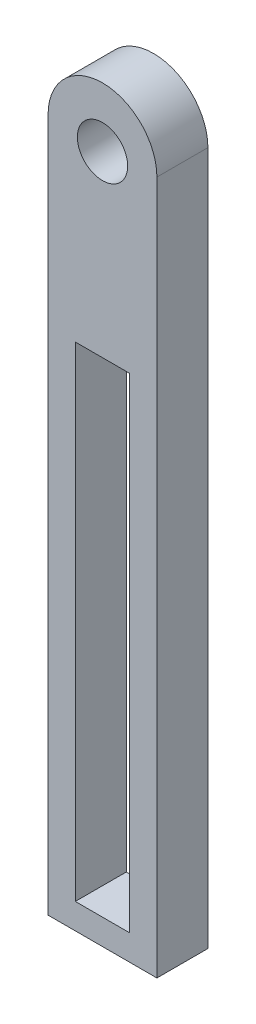
ISO-10303-21;
HEADER;
FILE_DESCRIPTION(('STEP AP214'),'2;1');
FILE_NAME('part.step','',(''),(''),'','','');
FILE_SCHEMA(('AUTOMOTIVE_DESIGN { 1 0 10303 214 1 1 1 1 }'));
ENDSEC;
DATA;
#1=APPLICATION_CONTEXT('core data for automotive mechanical design processes');
#2=APPLICATION_PROTOCOL_DEFINITION('international standard','automotive_design',2000,#1);
#3=PRODUCT_CONTEXT('',#1,'mechanical');
#4=PRODUCT('Part','Part','',(#3));
#5=PRODUCT_RELATED_PRODUCT_CATEGORY('part','',(#4));
#6=PRODUCT_DEFINITION_FORMATION('','',#4);
#7=PRODUCT_DEFINITION_CONTEXT('part definition',#1,'design');
#8=PRODUCT_DEFINITION('design','',#6,#7);
#9=PRODUCT_DEFINITION_SHAPE('','',#8);
#10=(LENGTH_UNIT() NAMED_UNIT(*) SI_UNIT(.MILLI.,.METRE.));
#11=(NAMED_UNIT(*) PLANE_ANGLE_UNIT() SI_UNIT($,.RADIAN.));
#12=(NAMED_UNIT(*) SI_UNIT($,.STERADIAN.) SOLID_ANGLE_UNIT());
#13=UNCERTAINTY_MEASURE_WITH_UNIT(LENGTH_MEASURE(1.E-05),#10,'distance_accuracy_value','');
#14=(GEOMETRIC_REPRESENTATION_CONTEXT(3) GLOBAL_UNCERTAINTY_ASSIGNED_CONTEXT((#13)) GLOBAL_UNIT_ASSIGNED_CONTEXT((#10,
#11,#12)) REPRESENTATION_CONTEXT('',''));
#15=CARTESIAN_POINT('',(0.,0.,0.));
#16=DIRECTION('',(0.,0.,1.));
#17=DIRECTION('',(1.,0.,0.));
#18=AXIS2_PLACEMENT_3D('',#15,#16,#17);
#19=CARTESIAN_POINT('',(-12.0601565913827,-20.4541960659235,9.525));
#20=DIRECTION('',(0.,0.,1.));
#21=DIRECTION('',(1.,0.,0.));
#22=AXIS2_PLACEMENT_3D('',#19,#20,#21);
#23=PLANE('',#22);
#24=DIRECTION('',(-1.,0.,0.));
#25=VECTOR('',#24,1.);
#26=CARTESIAN_POINT('',(-17.1401565913827,-54.7441960659235,9.525));
#27=LINE('',#26,#25);
#28=CARTESIAN_POINT('',(-6.98015659138272,-54.7441960659235,9.525));
#29=VERTEX_POINT('',#28);
#30=CARTESIAN_POINT('',(-17.1401565913827,-54.7441960659235,9.525));
#31=VERTEX_POINT('',#30);
#32=EDGE_CURVE('E114',#29,#31,#27,.T.);
#33=ORIENTED_EDGE('',*,*,#32,.F.);
#34=DIRECTION('',(0.,1.,0.));
#35=VECTOR('',#34,1.);
#36=CARTESIAN_POINT('',(-6.9801565913827,-145.231696065923,9.525));
#37=LINE('',#36,#35);
#38=CARTESIAN_POINT('',(-6.9801565913827,-145.231696065923,9.525));
#39=VERTEX_POINT('',#38);
#40=EDGE_CURVE('E105',#39,#29,#37,.T.);
#41=ORIENTED_EDGE('',*,*,#40,.F.);
#42=DIRECTION('',(1.,0.,0.));
#43=VECTOR('',#42,1.);
#44=CARTESIAN_POINT('',(-17.1401565913827,-145.231696065923,9.525));
#45=LINE('',#44,#43);
#46=CARTESIAN_POINT('',(-17.1401565913827,-145.231696065923,9.525));
#47=VERTEX_POINT('',#46);
#48=EDGE_CURVE('E132',#47,#39,#45,.T.);
#49=ORIENTED_EDGE('',*,*,#48,.F.);
#50=DIRECTION('',(0.,-1.,0.));
#51=VECTOR('',#50,1.);
#52=CARTESIAN_POINT('',(-17.1401565913827,-145.231696065923,9.525));
#53=LINE('',#52,#51);
#54=EDGE_CURVE('E128',#31,#47,#53,.T.);
#55=ORIENTED_EDGE('',*,*,#54,.F.);
#56=EDGE_LOOP('',(#33,#41,#49,#55));
#57=FACE_BOUND('',#56,.T.);
#58=CARTESIAN_POINT('',(-12.0601565913827,-20.4541960659235,9.525));
#59=DIRECTION('',(0.,0.,1.));
#60=DIRECTION('',(1.,0.,0.));
#61=AXIS2_PLACEMENT_3D('',#58,#59,#60);
#62=CIRCLE('',#61,10.16);
#63=CARTESIAN_POINT('',(-1.90015659138274,-20.4541960659234,9.525));
#64=VERTEX_POINT('',#63);
#65=CARTESIAN_POINT('',(-22.2201565913827,-20.4541960659235,9.525));
#66=VERTEX_POINT('',#65);
#67=EDGE_CURVE('E156',#64,#66,#62,.T.);
#68=ORIENTED_EDGE('',*,*,#67,.T.);
#69=DIRECTION('',(0.,-1.,0.));
#70=VECTOR('',#69,1.);
#71=CARTESIAN_POINT('',(-22.2201565913827,-20.4541960659235,9.525));
#72=LINE('',#71,#70);
#73=CARTESIAN_POINT('',(-22.2201565913827,-149.994196065923,9.525));
#74=VERTEX_POINT('',#73);
#75=EDGE_CURVE('E160',#66,#74,#72,.T.);
#76=ORIENTED_EDGE('',*,*,#75,.T.);
#77=DIRECTION('',(1.,0.,0.));
#78=VECTOR('',#77,1.);
#79=CARTESIAN_POINT('',(-22.2201565913827,-149.994196065923,9.525));
#80=LINE('',#79,#78);
#81=CARTESIAN_POINT('',(-1.90015659138269,-149.994196065923,9.525));
#82=VERTEX_POINT('',#81);
#83=EDGE_CURVE('E164',#74,#82,#80,.T.);
#84=ORIENTED_EDGE('',*,*,#83,.T.);
#85=DIRECTION('',(0.,1.,0.));
#86=VECTOR('',#85,1.);
#87=CARTESIAN_POINT('',(-1.90015659138274,-20.4541960659234,9.525));
#88=LINE('',#87,#86);
#89=EDGE_CURVE('E167',#82,#64,#88,.T.);
#90=ORIENTED_EDGE('',*,*,#89,.T.);
#91=EDGE_LOOP('',(#68,#76,#84,#90));
#92=FACE_BOUND('',#91,.T.);
#93=CARTESIAN_POINT('',(-12.0601565913827,-21.4066960659235,9.525));
#94=DIRECTION('',(0.,0.,1.));
#95=DIRECTION('',(1.,0.,0.));
#96=AXIS2_PLACEMENT_3D('',#93,#94,#95);
#97=CIRCLE('',#96,4.699);
#98=CARTESIAN_POINT('',(-16.7591565913827,-21.4066960659235,9.525));
#99=VERTEX_POINT('',#98);
#100=EDGE_CURVE('E140',#99,#99,#97,.T.);
#101=ORIENTED_EDGE('',*,*,#100,.F.);
#102=EDGE_LOOP('',(#101));
#103=FACE_BOUND('',#102,.T.);
#104=ADVANCED_FACE('F39',(#57,#92,#103),#23,.T.);
#105=CARTESIAN_POINT('',(-12.0601565913827,-20.4541960659235,0.));
#106=DIRECTION('',(0.,0.,1.));
#107=DIRECTION('',(1.,0.,0.));
#108=AXIS2_PLACEMENT_3D('',#105,#106,#107);
#109=PLANE('',#108);
#110=CARTESIAN_POINT('',(-12.0601565913827,-20.4541960659235,0.));
#111=DIRECTION('',(0.,0.,1.));
#112=DIRECTION('',(1.,0.,0.));
#113=AXIS2_PLACEMENT_3D('',#110,#111,#112);
#114=CIRCLE('',#113,10.16);
#115=CARTESIAN_POINT('',(-1.90015659138274,-20.4541960659234,0.));
#116=VERTEX_POINT('',#115);
#117=CARTESIAN_POINT('',(-22.2201565913827,-20.4541960659235,0.));
#118=VERTEX_POINT('',#117);
#119=EDGE_CURVE('E123',#116,#118,#114,.T.);
#120=ORIENTED_EDGE('',*,*,#119,.F.);
#121=DIRECTION('',(0.,1.,0.));
#122=VECTOR('',#121,1.);
#123=CARTESIAN_POINT('',(-1.90015659138274,-20.4541960659234,0.));
#124=LINE('',#123,#122);
#125=CARTESIAN_POINT('',(-1.90015659138269,-149.994196065923,0.));
#126=VERTEX_POINT('',#125);
#127=EDGE_CURVE('E161',#126,#116,#124,.T.);
#128=ORIENTED_EDGE('',*,*,#127,.F.);
#129=DIRECTION('',(1.,0.,0.));
#130=VECTOR('',#129,1.);
#131=CARTESIAN_POINT('',(-22.2201565913827,-149.994196065923,0.));
#132=LINE('',#131,#130);
#133=CARTESIAN_POINT('',(-22.2201565913827,-149.994196065923,0.));
#134=VERTEX_POINT('',#133);
#135=EDGE_CURVE('E177',#134,#126,#132,.T.);
#136=ORIENTED_EDGE('',*,*,#135,.F.);
#137=DIRECTION('',(0.,-1.,0.));
#138=VECTOR('',#137,1.);
#139=CARTESIAN_POINT('',(-22.2201565913827,-20.4541960659235,0.));
#140=LINE('',#139,#138);
#141=EDGE_CURVE('E174',#118,#134,#140,.T.);
#142=ORIENTED_EDGE('',*,*,#141,.F.);
#143=EDGE_LOOP('',(#120,#128,#136,#142));
#144=FACE_BOUND('',#143,.T.);
#145=DIRECTION('',(0.,1.,0.));
#146=VECTOR('',#145,1.);
#147=CARTESIAN_POINT('',(-6.9801565913827,-145.231696065923,0.));
#148=LINE('',#147,#146);
#149=CARTESIAN_POINT('',(-6.9801565913827,-145.231696065923,0.));
#150=VERTEX_POINT('',#149);
#151=CARTESIAN_POINT('',(-6.98015659138272,-54.7441960659235,0.));
#152=VERTEX_POINT('',#151);
#153=EDGE_CURVE('E63',#150,#152,#148,.T.);
#154=ORIENTED_EDGE('',*,*,#153,.T.);
#155=DIRECTION('',(-1.,0.,0.));
#156=VECTOR('',#155,1.);
#157=CARTESIAN_POINT('',(-17.1401565913827,-54.7441960659235,0.));
#158=LINE('',#157,#156);
#159=CARTESIAN_POINT('',(-17.1401565913827,-54.7441960659235,0.));
#160=VERTEX_POINT('',#159);
#161=EDGE_CURVE('E121',#152,#160,#158,.T.);
#162=ORIENTED_EDGE('',*,*,#161,.T.);
#163=DIRECTION('',(0.,-1.,0.));
#164=VECTOR('',#163,1.);
#165=CARTESIAN_POINT('',(-17.1401565913827,-145.231696065923,0.));
#166=LINE('',#165,#164);
#167=CARTESIAN_POINT('',(-17.1401565913827,-145.231696065923,0.));
#168=VERTEX_POINT('',#167);
#169=EDGE_CURVE('E143',#160,#168,#166,.T.);
#170=ORIENTED_EDGE('',*,*,#169,.T.);
#171=DIRECTION('',(1.,0.,0.));
#172=VECTOR('',#171,1.);
#173=CARTESIAN_POINT('',(-17.1401565913827,-145.231696065923,0.));
#174=LINE('',#173,#172);
#175=EDGE_CURVE('E115',#168,#150,#174,.T.);
#176=ORIENTED_EDGE('',*,*,#175,.T.);
#177=EDGE_LOOP('',(#154,#162,#170,#176));
#178=FACE_BOUND('',#177,.T.);
#179=CARTESIAN_POINT('',(-12.0601565913827,-21.4066960659235,0.));
#180=DIRECTION('',(0.,0.,1.));
#181=DIRECTION('',(1.,0.,0.));
#182=AXIS2_PLACEMENT_3D('',#179,#180,#181);
#183=CIRCLE('',#182,4.699);
#184=CARTESIAN_POINT('',(-16.7591565913827,-21.4066960659235,0.));
#185=VERTEX_POINT('',#184);
#186=EDGE_CURVE('E253',#185,#185,#183,.T.);
#187=ORIENTED_EDGE('',*,*,#186,.T.);
#188=EDGE_LOOP('',(#187));
#189=FACE_BOUND('',#188,.T.);
#190=ADVANCED_FACE('F200',(#144,#178,#189),#109,.F.);
#191=CARTESIAN_POINT('',(-12.0601565913827,-20.4541960659235,9.525));
#192=DIRECTION('',(0.,0.,-1.));
#193=DIRECTION('',(-1.,0.,0.));
#194=AXIS2_PLACEMENT_3D('',#191,#192,#193);
#195=CYLINDRICAL_SURFACE('',#194,10.16);
#196=ORIENTED_EDGE('',*,*,#119,.T.);
#197=DIRECTION('',(0.,0.,-1.));
#198=VECTOR('',#197,1.);
#199=CARTESIAN_POINT('',(-22.2201565913827,-20.4541960659235,9.525));
#200=LINE('',#199,#198);
#201=EDGE_CURVE('E11',#66,#118,#200,.T.);
#202=ORIENTED_EDGE('',*,*,#201,.F.);
#203=ORIENTED_EDGE('',*,*,#67,.F.);
#204=DIRECTION('',(0.,0.,-1.));
#205=VECTOR('',#204,1.);
#206=CARTESIAN_POINT('',(-1.90015659138274,-20.4541960659234,9.525));
#207=LINE('',#206,#205);
#208=EDGE_CURVE('E170',#64,#116,#207,.T.);
#209=ORIENTED_EDGE('',*,*,#208,.T.);
#210=EDGE_LOOP('',(#196,#202,#203,#209));
#211=FACE_BOUND('',#210,.T.);
#212=ADVANCED_FACE('F41',(#211),#195,.T.);
#213=CARTESIAN_POINT('',(-22.2201565913827,-20.4541960659235,9.525));
#214=DIRECTION('',(1.,0.,0.));
#215=DIRECTION('',(0.,1.,0.));
#216=AXIS2_PLACEMENT_3D('',#213,#214,#215);
#217=PLANE('',#216);
#218=ORIENTED_EDGE('',*,*,#141,.T.);
#219=DIRECTION('',(0.,0.,-1.));
#220=VECTOR('',#219,1.);
#221=CARTESIAN_POINT('',(-22.2201565913827,-149.994196065923,9.525));
#222=LINE('',#221,#220);
#223=EDGE_CURVE('E48',#74,#134,#222,.T.);
#224=ORIENTED_EDGE('',*,*,#223,.F.);
#225=ORIENTED_EDGE('',*,*,#75,.F.);
#226=ORIENTED_EDGE('',*,*,#201,.T.);
#227=EDGE_LOOP('',(#218,#224,#225,#226));
#228=FACE_BOUND('',#227,.T.);
#229=ADVANCED_FACE('F210',(#228),#217,.F.);
#230=CARTESIAN_POINT('',(-22.2201565913827,-149.994196065923,9.525));
#231=DIRECTION('',(0.,1.,0.));
#232=DIRECTION('',(0.,0.,1.));
#233=AXIS2_PLACEMENT_3D('',#230,#231,#232);
#234=PLANE('',#233);
#235=ORIENTED_EDGE('',*,*,#135,.T.);
#236=DIRECTION('',(0.,0.,-1.));
#237=VECTOR('',#236,1.);
#238=CARTESIAN_POINT('',(-1.90015659138269,-149.994196065923,9.525));
#239=LINE('',#238,#237);
#240=EDGE_CURVE('E185',#82,#126,#239,.T.);
#241=ORIENTED_EDGE('',*,*,#240,.F.);
#242=ORIENTED_EDGE('',*,*,#83,.F.);
#243=ORIENTED_EDGE('',*,*,#223,.T.);
#244=EDGE_LOOP('',(#235,#241,#242,#243));
#245=FACE_BOUND('',#244,.T.);
#246=ADVANCED_FACE('F194',(#245),#234,.F.);
#247=CARTESIAN_POINT('',(-1.90015659138274,-20.4541960659234,9.525));
#248=DIRECTION('',(-1.,0.,0.));
#249=DIRECTION('',(0.,-1.,0.));
#250=AXIS2_PLACEMENT_3D('',#247,#248,#249);
#251=PLANE('',#250);
#252=ORIENTED_EDGE('',*,*,#127,.T.);
#253=ORIENTED_EDGE('',*,*,#208,.F.);
#254=ORIENTED_EDGE('',*,*,#89,.F.);
#255=ORIENTED_EDGE('',*,*,#240,.T.);
#256=EDGE_LOOP('',(#252,#253,#254,#255));
#257=FACE_BOUND('',#256,.T.);
#258=ADVANCED_FACE('F204',(#257),#251,.F.);
#259=CARTESIAN_POINT('',(-6.9801565913827,-145.231696065923,9.525));
#260=DIRECTION('',(-1.,0.,0.));
#261=DIRECTION('',(0.,-1.,0.));
#262=AXIS2_PLACEMENT_3D('',#259,#260,#261);
#263=PLANE('',#262);
#264=ORIENTED_EDGE('',*,*,#153,.F.);
#265=DIRECTION('',(0.,0.,-1.));
#266=VECTOR('',#265,1.);
#267=CARTESIAN_POINT('',(-6.9801565913827,-145.231696065923,9.525));
#268=LINE('',#267,#266);
#269=EDGE_CURVE('E109',#39,#150,#268,.T.);
#270=ORIENTED_EDGE('',*,*,#269,.F.);
#271=ORIENTED_EDGE('',*,*,#40,.T.);
#272=DIRECTION('',(0.,0.,-1.));
#273=VECTOR('',#272,1.);
#274=CARTESIAN_POINT('',(-6.98015659138272,-54.7441960659235,9.525));
#275=LINE('',#274,#273);
#276=EDGE_CURVE('E108',#29,#152,#275,.T.);
#277=ORIENTED_EDGE('',*,*,#276,.T.);
#278=EDGE_LOOP('',(#264,#270,#271,#277));
#279=FACE_BOUND('',#278,.T.);
#280=ADVANCED_FACE('F107',(#279),#263,.T.);
#281=CARTESIAN_POINT('',(-17.1401565913827,-54.7441960659235,9.525));
#282=DIRECTION('',(0.,-1.,0.));
#283=DIRECTION('',(0.,0.,-1.));
#284=AXIS2_PLACEMENT_3D('',#281,#282,#283);
#285=PLANE('',#284);
#286=ORIENTED_EDGE('',*,*,#161,.F.);
#287=ORIENTED_EDGE('',*,*,#276,.F.);
#288=ORIENTED_EDGE('',*,*,#32,.T.);
#289=DIRECTION('',(0.,0.,-1.));
#290=VECTOR('',#289,1.);
#291=CARTESIAN_POINT('',(-17.1401565913827,-54.7441960659235,9.525));
#292=LINE('',#291,#290);
#293=EDGE_CURVE('E124',#31,#160,#292,.T.);
#294=ORIENTED_EDGE('',*,*,#293,.T.);
#295=EDGE_LOOP('',(#286,#287,#288,#294));
#296=FACE_BOUND('',#295,.T.);
#297=ADVANCED_FACE('F118',(#296),#285,.T.);
#298=CARTESIAN_POINT('',(-17.1401565913827,-145.231696065923,9.525));
#299=DIRECTION('',(1.,0.,0.));
#300=DIRECTION('',(0.,1.,0.));
#301=AXIS2_PLACEMENT_3D('',#298,#299,#300);
#302=PLANE('',#301);
#303=ORIENTED_EDGE('',*,*,#169,.F.);
#304=ORIENTED_EDGE('',*,*,#293,.F.);
#305=ORIENTED_EDGE('',*,*,#54,.T.);
#306=DIRECTION('',(0.,0.,-1.));
#307=VECTOR('',#306,1.);
#308=CARTESIAN_POINT('',(-17.1401565913827,-145.231696065923,9.525));
#309=LINE('',#308,#307);
#310=EDGE_CURVE('E55',#47,#168,#309,.T.);
#311=ORIENTED_EDGE('',*,*,#310,.T.);
#312=EDGE_LOOP('',(#303,#304,#305,#311));
#313=FACE_BOUND('',#312,.T.);
#314=ADVANCED_FACE('F233',(#313),#302,.T.);
#315=CARTESIAN_POINT('',(-17.1401565913827,-145.231696065923,9.525));
#316=DIRECTION('',(0.,1.,0.));
#317=DIRECTION('',(0.,0.,1.));
#318=AXIS2_PLACEMENT_3D('',#315,#316,#317);
#319=PLANE('',#318);
#320=ORIENTED_EDGE('',*,*,#175,.F.);
#321=ORIENTED_EDGE('',*,*,#310,.F.);
#322=ORIENTED_EDGE('',*,*,#48,.T.);
#323=ORIENTED_EDGE('',*,*,#269,.T.);
#324=EDGE_LOOP('',(#320,#321,#322,#323));
#325=FACE_BOUND('',#324,.T.);
#326=ADVANCED_FACE('F237',(#325),#319,.T.);
#327=CARTESIAN_POINT('',(-12.0601565913827,-21.4066960659235,9.525));
#328=DIRECTION('',(0.,0.,-1.));
#329=DIRECTION('',(-1.,0.,0.));
#330=AXIS2_PLACEMENT_3D('',#327,#328,#329);
#331=CYLINDRICAL_SURFACE('',#330,4.699);
#332=CARTESIAN_POINT('',(-16.7591565913827,-21.4066960659235,9.525));
#333=CARTESIAN_POINT('',(-16.7591565913827,-21.4066960659235,9.42578125));
#334=CARTESIAN_POINT('',(-16.7591565913827,-21.4066960659235,9.3265625));
#335=CARTESIAN_POINT('',(-16.7591565913827,-21.4066960659235,9.128125));
#336=CARTESIAN_POINT('',(-16.7591565913827,-21.4066960659235,9.02890625));
#337=CARTESIAN_POINT('',(-16.7591565913827,-21.4066960659235,8.83046875));
#338=CARTESIAN_POINT('',(-16.7591565913827,-21.4066960659235,8.73125));
#339=CARTESIAN_POINT('',(-16.7591565913827,-21.4066960659235,8.5328125));
#340=CARTESIAN_POINT('',(-16.7591565913827,-21.4066960659235,8.43359375));
#341=CARTESIAN_POINT('',(-16.7591565913827,-21.4066960659235,8.23515625));
#342=CARTESIAN_POINT('',(-16.7591565913827,-21.4066960659235,8.1359375));
#343=CARTESIAN_POINT('',(-16.7591565913827,-21.4066960659235,7.9375));
#344=CARTESIAN_POINT('',(-16.7591565913827,-21.4066960659235,7.83828125));
#345=CARTESIAN_POINT('',(-16.7591565913827,-21.4066960659235,7.63984375));
#346=CARTESIAN_POINT('',(-16.7591565913827,-21.4066960659235,7.540625));
#347=CARTESIAN_POINT('',(-16.7591565913827,-21.4066960659235,7.3421875));
#348=CARTESIAN_POINT('',(-16.7591565913827,-21.4066960659235,7.24296875));
#349=CARTESIAN_POINT('',(-16.7591565913827,-21.4066960659235,7.04453125));
#350=CARTESIAN_POINT('',(-16.7591565913827,-21.4066960659235,6.9453125));
#351=CARTESIAN_POINT('',(-16.7591565913827,-21.4066960659235,6.746875));
#352=CARTESIAN_POINT('',(-16.7591565913827,-21.4066960659235,6.64765625));
#353=CARTESIAN_POINT('',(-16.7591565913827,-21.4066960659235,6.44921875));
#354=CARTESIAN_POINT('',(-16.7591565913827,-21.4066960659235,6.35));
#355=CARTESIAN_POINT('',(-16.7591565913827,-21.4066960659235,6.1515625));
#356=CARTESIAN_POINT('',(-16.7591565913827,-21.4066960659235,6.05234375));
#357=CARTESIAN_POINT('',(-16.7591565913827,-21.4066960659235,5.85390625));
#358=CARTESIAN_POINT('',(-16.7591565913827,-21.4066960659235,5.7546875));
#359=CARTESIAN_POINT('',(-16.7591565913827,-21.4066960659235,5.55625));
#360=CARTESIAN_POINT('',(-16.7591565913827,-21.4066960659235,5.45703125));
#361=CARTESIAN_POINT('',(-16.7591565913827,-21.4066960659235,5.25859375));
#362=CARTESIAN_POINT('',(-16.7591565913827,-21.4066960659235,5.159375));
#363=CARTESIAN_POINT('',(-16.7591565913827,-21.4066960659235,4.9609375));
#364=CARTESIAN_POINT('',(-16.7591565913827,-21.4066960659235,4.86171875));
#365=CARTESIAN_POINT('',(-16.7591565913827,-21.4066960659235,4.66328125));
#366=CARTESIAN_POINT('',(-16.7591565913827,-21.4066960659235,4.5640625));
#367=CARTESIAN_POINT('',(-16.7591565913827,-21.4066960659235,4.365625));
#368=CARTESIAN_POINT('',(-16.7591565913827,-21.4066960659235,4.26640625));
#369=CARTESIAN_POINT('',(-16.7591565913827,-21.4066960659235,4.06796875));
#370=CARTESIAN_POINT('',(-16.7591565913827,-21.4066960659235,3.96875));
#371=CARTESIAN_POINT('',(-16.7591565913827,-21.4066960659235,3.7703125));
#372=CARTESIAN_POINT('',(-16.7591565913827,-21.4066960659235,3.67109375));
#373=CARTESIAN_POINT('',(-16.7591565913827,-21.4066960659235,3.47265625));
#374=CARTESIAN_POINT('',(-16.7591565913827,-21.4066960659235,3.3734375));
#375=CARTESIAN_POINT('',(-16.7591565913827,-21.4066960659235,3.175));
#376=CARTESIAN_POINT('',(-16.7591565913827,-21.4066960659235,3.07578125));
#377=CARTESIAN_POINT('',(-16.7591565913827,-21.4066960659235,2.87734375));
#378=CARTESIAN_POINT('',(-16.7591565913827,-21.4066960659235,2.778125));
#379=CARTESIAN_POINT('',(-16.7591565913827,-21.4066960659235,2.5796875));
#380=CARTESIAN_POINT('',(-16.7591565913827,-21.4066960659235,2.48046875));
#381=CARTESIAN_POINT('',(-16.7591565913827,-21.4066960659235,2.28203125));
#382=CARTESIAN_POINT('',(-16.7591565913827,-21.4066960659235,2.1828125));
#383=CARTESIAN_POINT('',(-16.7591565913827,-21.4066960659235,1.984375));
#384=CARTESIAN_POINT('',(-16.7591565913827,-21.4066960659235,1.88515625));
#385=CARTESIAN_POINT('',(-16.7591565913827,-21.4066960659235,1.68671875));
#386=CARTESIAN_POINT('',(-16.7591565913827,-21.4066960659235,1.5875));
#387=CARTESIAN_POINT('',(-16.7591565913827,-21.4066960659235,1.3890625));
#388=CARTESIAN_POINT('',(-16.7591565913827,-21.4066960659235,1.28984375));
#389=CARTESIAN_POINT('',(-16.7591565913827,-21.4066960659235,1.09140625));
#390=CARTESIAN_POINT('',(-16.7591565913827,-21.4066960659235,0.992187500000001));
#391=CARTESIAN_POINT('',(-16.7591565913827,-21.4066960659235,0.793750000000001));
#392=CARTESIAN_POINT('',(-16.7591565913827,-21.4066960659235,0.69453125));
#393=CARTESIAN_POINT('',(-16.7591565913827,-21.4066960659235,0.49609375));
#394=CARTESIAN_POINT('',(-16.7591565913827,-21.4066960659235,0.396875));
#395=CARTESIAN_POINT('',(-16.7591565913827,-21.4066960659235,0.1984375));
#396=CARTESIAN_POINT('',(-16.7591565913827,-21.4066960659235,0.0992187500000001));
#397=CARTESIAN_POINT('',(-16.7591565913827,-21.4066960659235,0.));
#398=B_SPLINE_CURVE_WITH_KNOTS('',3,(#332,#333,#334,#335,#336,#337,#338,#339,#340,#341,#342,
#343,#344,#345,#346,#347,#348,#349,#350,#351,#352,#353,#354,#355,#356,#357,#358,#359,#360,#361,
#362,#363,#364,#365,#366,#367,#368,#369,#370,#371,#372,#373,#374,#375,#376,#377,#378,#379,#380,
#381,#382,#383,#384,#385,#386,#387,#388,#389,#390,#391,#392,#393,#394,#395,#396,#397),
.UNSPECIFIED.,.F.,.F.,(4,2,2,2,2,2,2,2,2,2,2,2,2,2,2,2,2,2,2,2,2,2,2,2,2,2,2,2,2,2,2,2,4),(0.,
0.29765625,0.5953125,0.892968750000001,1.190625,1.48828125,1.7859375,2.08359375,2.38125,
2.67890625,2.9765625,3.27421875,3.571875,3.86953125,4.1671875,4.46484375,4.7625,5.06015625,
5.3578125,5.65546875,5.953125,6.25078125,6.5484375,6.84609375,7.14375,7.44140625,7.7390625,
8.03671875,8.334375,8.63203125,8.9296875,9.22734375,9.525),.UNSPECIFIED.);
#399=EDGE_CURVE('BSEAM243',#99,#185,#398,.T.);
#400=ORIENTED_EDGE('',*,*,#100,.T.);
#401=ORIENTED_EDGE('',*,*,#186,.F.);
#402=ORIENTED_EDGE('',*,*,#399,.T.);
#403=ORIENTED_EDGE('',*,*,#399,.F.);
#404=EDGE_LOOP('',(#400,#402,#401,#403));
#405=FACE_BOUND('',#404,.T.);
#406=ADVANCED_FACE('F243',(#405),#331,.F.);
#407=CLOSED_SHELL('',(#104,#190,#212,#229,#246,#258,#280,#297,#314,#326,#406));
#408=MANIFOLD_SOLID_BREP('B2',#407);
#409=ADVANCED_BREP_SHAPE_REPRESENTATION('',(#18,#408),#14);
#410=SHAPE_DEFINITION_REPRESENTATION(#9,#409);
ENDSEC;
END-ISO-10303-21;
